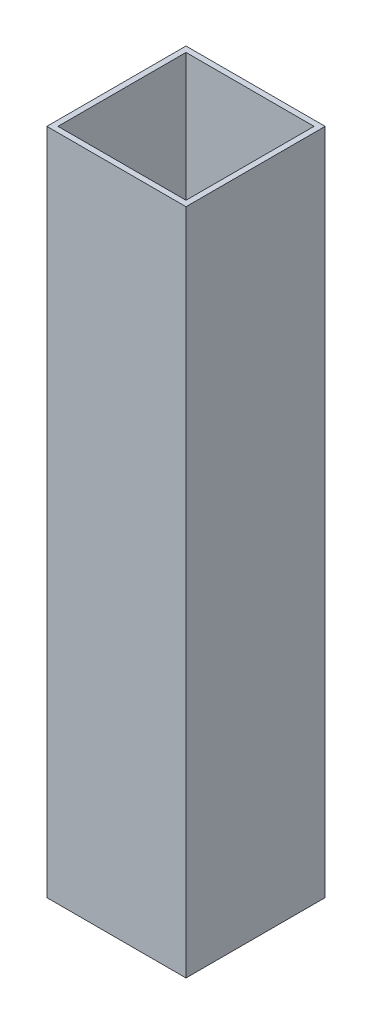
ISO-10303-21;
HEADER;
FILE_DESCRIPTION(('STEP AP214'),'2;1');
FILE_NAME('part.step','',(''),(''),'','','');
FILE_SCHEMA(('AUTOMOTIVE_DESIGN { 1 0 10303 214 1 1 1 1 }'));
ENDSEC;
DATA;
#1=APPLICATION_CONTEXT('core data for automotive mechanical design processes');
#2=APPLICATION_PROTOCOL_DEFINITION('international standard','automotive_design',2000,#1);
#3=PRODUCT_CONTEXT('',#1,'mechanical');
#4=PRODUCT('Part','Part','',(#3));
#5=PRODUCT_RELATED_PRODUCT_CATEGORY('part','',(#4));
#6=PRODUCT_DEFINITION_FORMATION('','',#4);
#7=PRODUCT_DEFINITION_CONTEXT('part definition',#1,'design');
#8=PRODUCT_DEFINITION('design','',#6,#7);
#9=PRODUCT_DEFINITION_SHAPE('','',#8);
#10=(LENGTH_UNIT() NAMED_UNIT(*) SI_UNIT(.MILLI.,.METRE.));
#11=(NAMED_UNIT(*) PLANE_ANGLE_UNIT() SI_UNIT($,.RADIAN.));
#12=(NAMED_UNIT(*) SI_UNIT($,.STERADIAN.) SOLID_ANGLE_UNIT());
#13=UNCERTAINTY_MEASURE_WITH_UNIT(LENGTH_MEASURE(1.E-05),#10,'distance_accuracy_value','');
#14=(GEOMETRIC_REPRESENTATION_CONTEXT(3) GLOBAL_UNCERTAINTY_ASSIGNED_CONTEXT((#13)) GLOBAL_UNIT_ASSIGNED_CONTEXT((#10,
#11,#12)) REPRESENTATION_CONTEXT('',''));
#15=CARTESIAN_POINT('',(0.,0.,0.));
#16=DIRECTION('',(0.,0.,1.));
#17=DIRECTION('',(1.,0.,0.));
#18=AXIS2_PLACEMENT_3D('',#15,#16,#17);
#19=CARTESIAN_POINT('',(0.,240.,0.));
#20=DIRECTION('',(0.,-1.,0.));
#21=DIRECTION('',(0.,0.,-1.));
#22=AXIS2_PLACEMENT_3D('',#19,#20,#21);
#23=PLANE('',#22);
#24=DIRECTION('',(0.,0.,-1.));
#25=VECTOR('',#24,1.);
#26=CARTESIAN_POINT('',(25.,240.,25.));
#27=LINE('',#26,#25);
#28=CARTESIAN_POINT('',(25.,240.,25.));
#29=VERTEX_POINT('',#28);
#30=CARTESIAN_POINT('',(25.,240.,-25.));
#31=VERTEX_POINT('',#30);
#32=EDGE_CURVE('E153',#29,#31,#27,.T.);
#33=ORIENTED_EDGE('',*,*,#32,.T.);
#34=DIRECTION('',(-1.,0.,0.));
#35=VECTOR('',#34,1.);
#36=CARTESIAN_POINT('',(-25.,240.,-25.));
#37=LINE('',#36,#35);
#38=CARTESIAN_POINT('',(-25.,240.,-25.));
#39=VERTEX_POINT('',#38);
#40=EDGE_CURVE('E157',#31,#39,#37,.T.);
#41=ORIENTED_EDGE('',*,*,#40,.T.);
#42=DIRECTION('',(0.,0.,1.));
#43=VECTOR('',#42,1.);
#44=CARTESIAN_POINT('',(-25.,240.,25.));
#45=LINE('',#44,#43);
#46=CARTESIAN_POINT('',(-25.,240.,25.));
#47=VERTEX_POINT('',#46);
#48=EDGE_CURVE('E161',#39,#47,#45,.T.);
#49=ORIENTED_EDGE('',*,*,#48,.T.);
#50=DIRECTION('',(1.,0.,0.));
#51=VECTOR('',#50,1.);
#52=CARTESIAN_POINT('',(-25.,240.,25.));
#53=LINE('',#52,#51);
#54=EDGE_CURVE('E164',#47,#29,#53,.T.);
#55=ORIENTED_EDGE('',*,*,#54,.T.);
#56=EDGE_LOOP('',(#33,#41,#49,#55));
#57=FACE_BOUND('',#56,.T.);
#58=DIRECTION('',(0.,0.,1.));
#59=VECTOR('',#58,1.);
#60=CARTESIAN_POINT('',(-23.,240.,23.));
#61=LINE('',#60,#59);
#62=CARTESIAN_POINT('',(-23.,240.,-23.));
#63=VERTEX_POINT('',#62);
#64=CARTESIAN_POINT('',(-23.,240.,23.));
#65=VERTEX_POINT('',#64);
#66=EDGE_CURVE('E105',#63,#65,#61,.T.);
#67=ORIENTED_EDGE('',*,*,#66,.F.);
#68=DIRECTION('',(-1.,0.,0.));
#69=VECTOR('',#68,1.);
#70=CARTESIAN_POINT('',(-23.,240.,-23.));
#71=LINE('',#70,#69);
#72=CARTESIAN_POINT('',(23.,240.,-23.));
#73=VERTEX_POINT('',#72);
#74=EDGE_CURVE('E131',#73,#63,#71,.T.);
#75=ORIENTED_EDGE('',*,*,#74,.F.);
#76=DIRECTION('',(0.,0.,-1.));
#77=VECTOR('',#76,1.);
#78=CARTESIAN_POINT('',(23.,240.,23.));
#79=LINE('',#78,#77);
#80=CARTESIAN_POINT('',(23.,240.,23.));
#81=VERTEX_POINT('',#80);
#82=EDGE_CURVE('E127',#81,#73,#79,.T.);
#83=ORIENTED_EDGE('',*,*,#82,.F.);
#84=DIRECTION('',(1.,0.,0.));
#85=VECTOR('',#84,1.);
#86=CARTESIAN_POINT('',(-23.,240.,23.));
#87=LINE('',#86,#85);
#88=EDGE_CURVE('E114',#65,#81,#87,.T.);
#89=ORIENTED_EDGE('',*,*,#88,.F.);
#90=EDGE_LOOP('',(#67,#75,#83,#89));
#91=FACE_BOUND('',#90,.T.);
#92=ADVANCED_FACE('F39',(#57,#91),#23,.F.);
#93=CARTESIAN_POINT('',(0.,0.,0.));
#94=DIRECTION('',(0.,-1.,0.));
#95=DIRECTION('',(0.,0.,-1.));
#96=AXIS2_PLACEMENT_3D('',#93,#94,#95);
#97=PLANE('',#96);
#98=DIRECTION('',(0.,0.,-1.));
#99=VECTOR('',#98,1.);
#100=CARTESIAN_POINT('',(25.,0.,25.));
#101=LINE('',#100,#99);
#102=CARTESIAN_POINT('',(25.,0.,25.));
#103=VERTEX_POINT('',#102);
#104=CARTESIAN_POINT('',(25.,0.,-25.));
#105=VERTEX_POINT('',#104);
#106=EDGE_CURVE('E123',#103,#105,#101,.T.);
#107=ORIENTED_EDGE('',*,*,#106,.F.);
#108=DIRECTION('',(1.,0.,0.));
#109=VECTOR('',#108,1.);
#110=CARTESIAN_POINT('',(-25.,0.,25.));
#111=LINE('',#110,#109);
#112=CARTESIAN_POINT('',(-25.,0.,25.));
#113=VERTEX_POINT('',#112);
#114=EDGE_CURVE('E158',#113,#103,#111,.T.);
#115=ORIENTED_EDGE('',*,*,#114,.F.);
#116=DIRECTION('',(0.,0.,1.));
#117=VECTOR('',#116,1.);
#118=CARTESIAN_POINT('',(-25.,0.,25.));
#119=LINE('',#118,#117);
#120=CARTESIAN_POINT('',(-25.,0.,-25.));
#121=VERTEX_POINT('',#120);
#122=EDGE_CURVE('E174',#121,#113,#119,.T.);
#123=ORIENTED_EDGE('',*,*,#122,.F.);
#124=DIRECTION('',(-1.,0.,0.));
#125=VECTOR('',#124,1.);
#126=CARTESIAN_POINT('',(-25.,0.,-25.));
#127=LINE('',#126,#125);
#128=EDGE_CURVE('E171',#105,#121,#127,.T.);
#129=ORIENTED_EDGE('',*,*,#128,.F.);
#130=EDGE_LOOP('',(#107,#115,#123,#129));
#131=FACE_BOUND('',#130,.T.);
#132=DIRECTION('',(-1.,0.,0.));
#133=VECTOR('',#132,1.);
#134=CARTESIAN_POINT('',(-23.,0.,-23.));
#135=LINE('',#134,#133);
#136=CARTESIAN_POINT('',(23.,0.,-23.));
#137=VERTEX_POINT('',#136);
#138=CARTESIAN_POINT('',(-23.,0.,-23.));
#139=VERTEX_POINT('',#138);
#140=EDGE_CURVE('E115',#137,#139,#135,.T.);
#141=ORIENTED_EDGE('',*,*,#140,.T.);
#142=DIRECTION('',(0.,0.,1.));
#143=VECTOR('',#142,1.);
#144=CARTESIAN_POINT('',(-23.,0.,23.));
#145=LINE('',#144,#143);
#146=CARTESIAN_POINT('',(-23.,0.,23.));
#147=VERTEX_POINT('',#146);
#148=EDGE_CURVE('E63',#139,#147,#145,.T.);
#149=ORIENTED_EDGE('',*,*,#148,.T.);
#150=DIRECTION('',(1.,0.,0.));
#151=VECTOR('',#150,1.);
#152=CARTESIAN_POINT('',(-23.,0.,23.));
#153=LINE('',#152,#151);
#154=CARTESIAN_POINT('',(23.,0.,23.));
#155=VERTEX_POINT('',#154);
#156=EDGE_CURVE('E121',#147,#155,#153,.T.);
#157=ORIENTED_EDGE('',*,*,#156,.T.);
#158=DIRECTION('',(0.,0.,-1.));
#159=VECTOR('',#158,1.);
#160=CARTESIAN_POINT('',(23.,0.,23.));
#161=LINE('',#160,#159);
#162=EDGE_CURVE('E140',#155,#137,#161,.T.);
#163=ORIENTED_EDGE('',*,*,#162,.T.);
#164=EDGE_LOOP('',(#141,#149,#157,#163));
#165=FACE_BOUND('',#164,.T.);
#166=ADVANCED_FACE('F197',(#131,#165),#97,.T.);
#167=CARTESIAN_POINT('',(25.,240.,25.));
#168=DIRECTION('',(-1.,0.,0.));
#169=DIRECTION('',(0.,0.,1.));
#170=AXIS2_PLACEMENT_3D('',#167,#168,#169);
#171=PLANE('',#170);
#172=ORIENTED_EDGE('',*,*,#106,.T.);
#173=DIRECTION('',(0.,-1.,0.));
#174=VECTOR('',#173,1.);
#175=CARTESIAN_POINT('',(25.,240.,-25.));
#176=LINE('',#175,#174);
#177=EDGE_CURVE('E11',#31,#105,#176,.T.);
#178=ORIENTED_EDGE('',*,*,#177,.F.);
#179=ORIENTED_EDGE('',*,*,#32,.F.);
#180=DIRECTION('',(0.,-1.,0.));
#181=VECTOR('',#180,1.);
#182=CARTESIAN_POINT('',(25.,240.,25.));
#183=LINE('',#182,#181);
#184=EDGE_CURVE('E167',#29,#103,#183,.T.);
#185=ORIENTED_EDGE('',*,*,#184,.T.);
#186=EDGE_LOOP('',(#172,#178,#179,#185));
#187=FACE_BOUND('',#186,.T.);
#188=ADVANCED_FACE('F41',(#187),#171,.F.);
#189=CARTESIAN_POINT('',(-25.,240.,-25.));
#190=DIRECTION('',(0.,0.,1.));
#191=DIRECTION('',(1.,0.,0.));
#192=AXIS2_PLACEMENT_3D('',#189,#190,#191);
#193=PLANE('',#192);
#194=ORIENTED_EDGE('',*,*,#128,.T.);
#195=DIRECTION('',(0.,-1.,0.));
#196=VECTOR('',#195,1.);
#197=CARTESIAN_POINT('',(-25.,240.,-25.));
#198=LINE('',#197,#196);
#199=EDGE_CURVE('E48',#39,#121,#198,.T.);
#200=ORIENTED_EDGE('',*,*,#199,.F.);
#201=ORIENTED_EDGE('',*,*,#40,.F.);
#202=ORIENTED_EDGE('',*,*,#177,.T.);
#203=EDGE_LOOP('',(#194,#200,#201,#202));
#204=FACE_BOUND('',#203,.T.);
#205=ADVANCED_FACE('F207',(#204),#193,.F.);
#206=CARTESIAN_POINT('',(-25.,240.,25.));
#207=DIRECTION('',(1.,0.,0.));
#208=DIRECTION('',(0.,0.,-1.));
#209=AXIS2_PLACEMENT_3D('',#206,#207,#208);
#210=PLANE('',#209);
#211=ORIENTED_EDGE('',*,*,#122,.T.);
#212=DIRECTION('',(0.,-1.,0.));
#213=VECTOR('',#212,1.);
#214=CARTESIAN_POINT('',(-25.,240.,25.));
#215=LINE('',#214,#213);
#216=EDGE_CURVE('E182',#47,#113,#215,.T.);
#217=ORIENTED_EDGE('',*,*,#216,.F.);
#218=ORIENTED_EDGE('',*,*,#48,.F.);
#219=ORIENTED_EDGE('',*,*,#199,.T.);
#220=EDGE_LOOP('',(#211,#217,#218,#219));
#221=FACE_BOUND('',#220,.T.);
#222=ADVANCED_FACE('F191',(#221),#210,.F.);
#223=CARTESIAN_POINT('',(-25.,240.,25.));
#224=DIRECTION('',(0.,0.,-1.));
#225=DIRECTION('',(-1.,0.,0.));
#226=AXIS2_PLACEMENT_3D('',#223,#224,#225);
#227=PLANE('',#226);
#228=ORIENTED_EDGE('',*,*,#114,.T.);
#229=ORIENTED_EDGE('',*,*,#184,.F.);
#230=ORIENTED_EDGE('',*,*,#54,.F.);
#231=ORIENTED_EDGE('',*,*,#216,.T.);
#232=EDGE_LOOP('',(#228,#229,#230,#231));
#233=FACE_BOUND('',#232,.T.);
#234=ADVANCED_FACE('F201',(#233),#227,.F.);
#235=CARTESIAN_POINT('',(-23.,240.,23.));
#236=DIRECTION('',(1.,0.,0.));
#237=DIRECTION('',(0.,0.,-1.));
#238=AXIS2_PLACEMENT_3D('',#235,#236,#237);
#239=PLANE('',#238);
#240=ORIENTED_EDGE('',*,*,#148,.F.);
#241=DIRECTION('',(0.,-1.,0.));
#242=VECTOR('',#241,1.);
#243=CARTESIAN_POINT('',(-23.,240.,-23.));
#244=LINE('',#243,#242);
#245=EDGE_CURVE('E109',#63,#139,#244,.T.);
#246=ORIENTED_EDGE('',*,*,#245,.F.);
#247=ORIENTED_EDGE('',*,*,#66,.T.);
#248=DIRECTION('',(0.,-1.,0.));
#249=VECTOR('',#248,1.);
#250=CARTESIAN_POINT('',(-23.,240.,23.));
#251=LINE('',#250,#249);
#252=EDGE_CURVE('E108',#65,#147,#251,.T.);
#253=ORIENTED_EDGE('',*,*,#252,.T.);
#254=EDGE_LOOP('',(#240,#246,#247,#253));
#255=FACE_BOUND('',#254,.T.);
#256=ADVANCED_FACE('F107',(#255),#239,.T.);
#257=CARTESIAN_POINT('',(-23.,240.,23.));
#258=DIRECTION('',(0.,0.,-1.));
#259=DIRECTION('',(-1.,0.,0.));
#260=AXIS2_PLACEMENT_3D('',#257,#258,#259);
#261=PLANE('',#260);
#262=ORIENTED_EDGE('',*,*,#156,.F.);
#263=ORIENTED_EDGE('',*,*,#252,.F.);
#264=ORIENTED_EDGE('',*,*,#88,.T.);
#265=DIRECTION('',(0.,-1.,0.));
#266=VECTOR('',#265,1.);
#267=CARTESIAN_POINT('',(23.,240.,23.));
#268=LINE('',#267,#266);
#269=EDGE_CURVE('E124',#81,#155,#268,.T.);
#270=ORIENTED_EDGE('',*,*,#269,.T.);
#271=EDGE_LOOP('',(#262,#263,#264,#270));
#272=FACE_BOUND('',#271,.T.);
#273=ADVANCED_FACE('F118',(#272),#261,.T.);
#274=CARTESIAN_POINT('',(23.,240.,23.));
#275=DIRECTION('',(-1.,0.,0.));
#276=DIRECTION('',(0.,0.,1.));
#277=AXIS2_PLACEMENT_3D('',#274,#275,#276);
#278=PLANE('',#277);
#279=ORIENTED_EDGE('',*,*,#162,.F.);
#280=ORIENTED_EDGE('',*,*,#269,.F.);
#281=ORIENTED_EDGE('',*,*,#82,.T.);
#282=DIRECTION('',(0.,-1.,0.));
#283=VECTOR('',#282,1.);
#284=CARTESIAN_POINT('',(23.,240.,-23.));
#285=LINE('',#284,#283);
#286=EDGE_CURVE('E55',#73,#137,#285,.T.);
#287=ORIENTED_EDGE('',*,*,#286,.T.);
#288=EDGE_LOOP('',(#279,#280,#281,#287));
#289=FACE_BOUND('',#288,.T.);
#290=ADVANCED_FACE('F230',(#289),#278,.T.);
#291=CARTESIAN_POINT('',(-23.,240.,-23.));
#292=DIRECTION('',(0.,0.,1.));
#293=DIRECTION('',(1.,0.,0.));
#294=AXIS2_PLACEMENT_3D('',#291,#292,#293);
#295=PLANE('',#294);
#296=ORIENTED_EDGE('',*,*,#140,.F.);
#297=ORIENTED_EDGE('',*,*,#286,.F.);
#298=ORIENTED_EDGE('',*,*,#74,.T.);
#299=ORIENTED_EDGE('',*,*,#245,.T.);
#300=EDGE_LOOP('',(#296,#297,#298,#299));
#301=FACE_BOUND('',#300,.T.);
#302=ADVANCED_FACE('F234',(#301),#295,.T.);
#303=CLOSED_SHELL('',(#92,#166,#188,#205,#222,#234,#256,#273,#290,#302));
#304=MANIFOLD_SOLID_BREP('B2',#303);
#305=ADVANCED_BREP_SHAPE_REPRESENTATION('',(#18,#304),#14);
#306=SHAPE_DEFINITION_REPRESENTATION(#9,#305);
ENDSEC;
END-ISO-10303-21;
